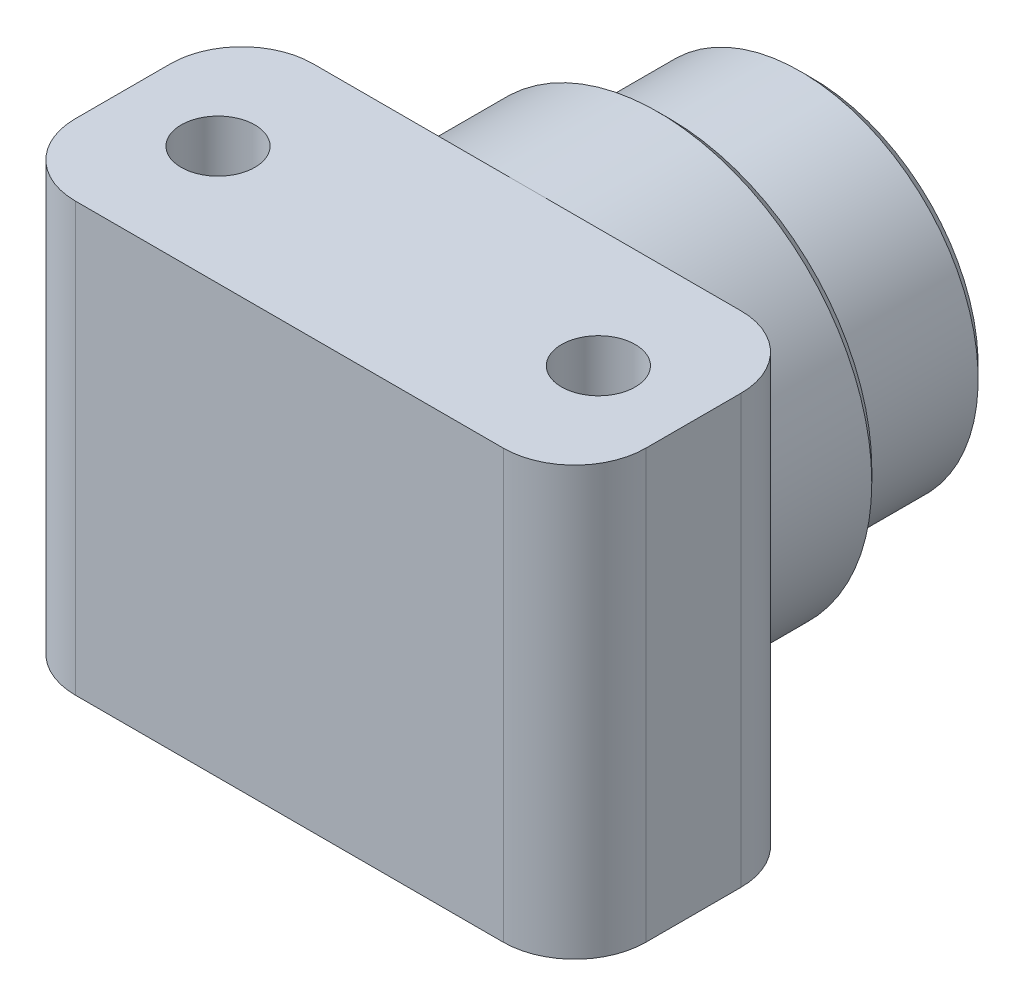
ISO-10303-21;
HEADER;
FILE_DESCRIPTION(('STEP AP214'),'2;1');
FILE_NAME('part.step','',(''),(''),'','','');
FILE_SCHEMA(('AUTOMOTIVE_DESIGN { 1 0 10303 214 1 1 1 1 }'));
ENDSEC;
DATA;
#1=APPLICATION_CONTEXT('core data for automotive mechanical design processes');
#2=APPLICATION_PROTOCOL_DEFINITION('international standard','automotive_design',2000,#1);
#3=PRODUCT_CONTEXT('',#1,'mechanical');
#4=PRODUCT('Part','Part','',(#3));
#5=PRODUCT_RELATED_PRODUCT_CATEGORY('part','',(#4));
#6=PRODUCT_DEFINITION_FORMATION('','',#4);
#7=PRODUCT_DEFINITION_CONTEXT('part definition',#1,'design');
#8=PRODUCT_DEFINITION('design','',#6,#7);
#9=PRODUCT_DEFINITION_SHAPE('','',#8);
#10=(LENGTH_UNIT() NAMED_UNIT(*) SI_UNIT(.MILLI.,.METRE.));
#11=(NAMED_UNIT(*) PLANE_ANGLE_UNIT() SI_UNIT($,.RADIAN.));
#12=(NAMED_UNIT(*) SI_UNIT($,.STERADIAN.) SOLID_ANGLE_UNIT());
#13=UNCERTAINTY_MEASURE_WITH_UNIT(LENGTH_MEASURE(1.E-05),#10,'distance_accuracy_value','');
#14=(GEOMETRIC_REPRESENTATION_CONTEXT(3) GLOBAL_UNCERTAINTY_ASSIGNED_CONTEXT((#13)) GLOBAL_UNIT_ASSIGNED_CONTEXT((#10,
#11,#12)) REPRESENTATION_CONTEXT('',''));
#15=CARTESIAN_POINT('',(0.,0.,0.));
#16=DIRECTION('',(0.,0.,1.));
#17=DIRECTION('',(1.,0.,0.));
#18=AXIS2_PLACEMENT_3D('',#15,#16,#17);
#19=CARTESIAN_POINT('',(0.,0.,0.));
#20=DIRECTION('',(0.,0.,1.));
#21=DIRECTION('',(1.,0.,0.));
#22=AXIS2_PLACEMENT_3D('',#19,#20,#21);
#23=PLANE('',#22);
#24=DIRECTION('',(1.,0.,0.));
#25=VECTOR('',#24,1.);
#26=CARTESIAN_POINT('',(-12.,-9.,0.));
#27=LINE('',#26,#25);
#28=CARTESIAN_POINT('',(-9.,-9.,0.));
#29=VERTEX_POINT('',#28);
#30=CARTESIAN_POINT('',(0.,-9.,0.));
#31=VERTEX_POINT('',#30);
#32=EDGE_CURVE('E110',#29,#31,#27,.T.);
#33=ORIENTED_EDGE('',*,*,#32,.F.);
#34=DIRECTION('',(0.,-1.,0.));
#35=VECTOR('',#34,1.);
#36=CARTESIAN_POINT('',(-9.,0.,0.));
#37=LINE('',#36,#35);
#38=CARTESIAN_POINT('',(-9.,0.,0.));
#39=VERTEX_POINT('',#38);
#40=EDGE_CURVE('E11',#29,#39,#37,.F.);
#41=ORIENTED_EDGE('',*,*,#40,.T.);
#42=CARTESIAN_POINT('',(0.,0.,0.));
#43=DIRECTION('',(0.,0.,1.));
#44=DIRECTION('',(1.,0.,0.));
#45=AXIS2_PLACEMENT_3D('',#42,#43,#44);
#46=CIRCLE('',#45,9.);
#47=EDGE_CURVE('E108',#39,#31,#46,.T.);
#48=ORIENTED_EDGE('',*,*,#47,.T.);
#49=EDGE_LOOP('',(#33,#41,#48));
#50=FACE_BOUND('',#49,.T.);
#51=ADVANCED_FACE('F34',(#50),#23,.F.);
#52=DIRECTION('',(-1.,0.,0.));
#53=VECTOR('',#52,1.);
#54=CARTESIAN_POINT('',(-12.,9.,0.));
#55=LINE('',#54,#53);
#56=CARTESIAN_POINT('',(9.,9.,0.));
#57=VERTEX_POINT('',#56);
#58=CARTESIAN_POINT('',(0.,9.,0.));
#59=VERTEX_POINT('',#58);
#60=EDGE_CURVE('E138',#57,#59,#55,.T.);
#61=ORIENTED_EDGE('',*,*,#60,.F.);
#62=DIRECTION('',(0.,1.,0.));
#63=VECTOR('',#62,1.);
#64=CARTESIAN_POINT('',(9.,0.,0.));
#65=LINE('',#64,#63);
#66=CARTESIAN_POINT('',(9.,0.,0.));
#67=VERTEX_POINT('',#66);
#68=EDGE_CURVE('E55',#57,#67,#65,.F.);
#69=ORIENTED_EDGE('',*,*,#68,.T.);
#70=EDGE_CURVE('E118',#67,#59,#46,.T.);
#71=ORIENTED_EDGE('',*,*,#70,.T.);
#72=EDGE_LOOP('',(#61,#69,#71));
#73=FACE_BOUND('',#72,.T.);
#74=ADVANCED_FACE('F259',(#73),#23,.F.);
#75=EDGE_CURVE('E115',#59,#39,#46,.T.);
#76=ORIENTED_EDGE('',*,*,#75,.T.);
#77=DIRECTION('',(0.,-1.,0.));
#78=VECTOR('',#77,1.);
#79=CARTESIAN_POINT('',(-9.,0.,0.));
#80=LINE('',#79,#78);
#81=CARTESIAN_POINT('',(-9.,9.,0.));
#82=VERTEX_POINT('',#81);
#83=EDGE_CURVE('E42',#39,#82,#80,.F.);
#84=ORIENTED_EDGE('',*,*,#83,.T.);
#85=EDGE_CURVE('E140',#59,#82,#55,.T.);
#86=ORIENTED_EDGE('',*,*,#85,.F.);
#87=EDGE_LOOP('',(#76,#84,#86));
#88=FACE_BOUND('',#87,.T.);
#89=ADVANCED_FACE('F211',(#88),#23,.F.);
#90=CARTESIAN_POINT('',(12.,9.,10.));
#91=DIRECTION('',(-1.,0.,0.));
#92=DIRECTION('',(0.,-1.,0.));
#93=AXIS2_PLACEMENT_3D('',#90,#91,#92);
#94=PLANE('',#93);
#95=DIRECTION('',(0.,0.,-1.));
#96=VECTOR('',#95,1.);
#97=CARTESIAN_POINT('',(12.,9.,10.));
#98=LINE('',#97,#96);
#99=CARTESIAN_POINT('',(12.,9.,7.));
#100=VERTEX_POINT('',#99);
#101=CARTESIAN_POINT('',(12.,9.,3.));
#102=VERTEX_POINT('',#101);
#103=EDGE_CURVE('E153',#100,#102,#98,.T.);
#104=ORIENTED_EDGE('',*,*,#103,.F.);
#105=DIRECTION('',(0.,1.,0.));
#106=VECTOR('',#105,1.);
#107=CARTESIAN_POINT('',(12.,-9.,7.));
#108=LINE('',#107,#106);
#109=CARTESIAN_POINT('',(12.,-9.,7.));
#110=VERTEX_POINT('',#109);
#111=EDGE_CURVE('E192',#100,#110,#108,.F.);
#112=ORIENTED_EDGE('',*,*,#111,.T.);
#113=DIRECTION('',(0.,0.,-1.));
#114=VECTOR('',#113,1.);
#115=CARTESIAN_POINT('',(12.,-9.,10.));
#116=LINE('',#115,#114);
#117=CARTESIAN_POINT('',(12.,-9.,3.));
#118=VERTEX_POINT('',#117);
#119=EDGE_CURVE('E144',#110,#118,#116,.T.);
#120=ORIENTED_EDGE('',*,*,#119,.T.);
#121=DIRECTION('',(0.,1.,0.));
#122=VECTOR('',#121,1.);
#123=CARTESIAN_POINT('',(12.,9.,3.));
#124=LINE('',#123,#122);
#125=EDGE_CURVE('E189',#118,#102,#124,.T.);
#126=ORIENTED_EDGE('',*,*,#125,.T.);
#127=EDGE_LOOP('',(#104,#112,#120,#126));
#128=FACE_BOUND('',#127,.T.);
#129=ADVANCED_FACE('F271',(#128),#94,.F.);
#130=CARTESIAN_POINT('',(-12.,9.,10.));
#131=DIRECTION('',(0.,-1.,0.));
#132=DIRECTION('',(0.,0.,-1.));
#133=AXIS2_PLACEMENT_3D('',#130,#131,#132);
#134=PLANE('',#133);
#135=CARTESIAN_POINT('',(8.,9.,5.));
#136=DIRECTION('',(0.,1.,0.));
#137=DIRECTION('',(0.,0.,1.));
#138=AXIS2_PLACEMENT_3D('',#135,#136,#137);
#139=CIRCLE('',#138,1.55);
#140=CARTESIAN_POINT('',(8.,9.,6.55));
#141=VERTEX_POINT('',#140);
#142=EDGE_CURVE('E162',#141,#141,#139,.T.);
#143=ORIENTED_EDGE('',*,*,#142,.F.);
#144=EDGE_LOOP('',(#143));
#145=FACE_BOUND('',#144,.T.);
#146=CARTESIAN_POINT('',(-8.,9.,5.));
#147=DIRECTION('',(0.,1.,0.));
#148=DIRECTION('',(0.,0.,1.));
#149=AXIS2_PLACEMENT_3D('',#146,#147,#148);
#150=CIRCLE('',#149,1.55);
#151=CARTESIAN_POINT('',(-8.,9.,6.55));
#152=VERTEX_POINT('',#151);
#153=EDGE_CURVE('E158',#152,#152,#150,.T.);
#154=ORIENTED_EDGE('',*,*,#153,.F.);
#155=EDGE_LOOP('',(#154));
#156=FACE_BOUND('',#155,.T.);
#157=DIRECTION('',(-1.,0.,0.));
#158=VECTOR('',#157,1.);
#159=CARTESIAN_POINT('',(-12.,9.,10.));
#160=LINE('',#159,#158);
#161=CARTESIAN_POINT('',(9.,9.,10.));
#162=VERTEX_POINT('',#161);
#163=CARTESIAN_POINT('',(-9.,9.,10.));
#164=VERTEX_POINT('',#163);
#165=EDGE_CURVE('E128',#162,#164,#160,.T.);
#166=ORIENTED_EDGE('',*,*,#165,.F.);
#167=CARTESIAN_POINT('',(9.,9.,7.));
#168=DIRECTION('',(0.,-1.,0.));
#169=DIRECTION('',(0.,0.,-1.));
#170=AXIS2_PLACEMENT_3D('',#167,#168,#169);
#171=CIRCLE('',#170,3.);
#172=EDGE_CURVE('E187',#162,#100,#171,.F.);
#173=ORIENTED_EDGE('',*,*,#172,.T.);
#174=ORIENTED_EDGE('',*,*,#103,.T.);
#175=CARTESIAN_POINT('',(9.,9.,3.));
#176=DIRECTION('',(0.,-1.,0.));
#177=DIRECTION('',(0.,0.,-1.));
#178=AXIS2_PLACEMENT_3D('',#175,#176,#177);
#179=CIRCLE('',#178,3.);
#180=EDGE_CURVE('E185',#102,#57,#179,.F.);
#181=ORIENTED_EDGE('',*,*,#180,.T.);
#182=ORIENTED_EDGE('',*,*,#60,.T.);
#183=ORIENTED_EDGE('',*,*,#85,.T.);
#184=CARTESIAN_POINT('',(-9.,9.,3.));
#185=DIRECTION('',(0.,-1.,0.));
#186=DIRECTION('',(0.,0.,-1.));
#187=AXIS2_PLACEMENT_3D('',#184,#185,#186);
#188=CIRCLE('',#187,3.);
#189=CARTESIAN_POINT('',(-12.,9.,3.));
#190=VERTEX_POINT('',#189);
#191=EDGE_CURVE('E181',#82,#190,#188,.F.);
#192=ORIENTED_EDGE('',*,*,#191,.T.);
#193=DIRECTION('',(0.,0.,-1.));
#194=VECTOR('',#193,1.);
#195=CARTESIAN_POINT('',(-12.,9.,10.));
#196=LINE('',#195,#194);
#197=CARTESIAN_POINT('',(-12.,9.,7.));
#198=VERTEX_POINT('',#197);
#199=EDGE_CURVE('E150',#198,#190,#196,.T.);
#200=ORIENTED_EDGE('',*,*,#199,.F.);
#201=CARTESIAN_POINT('',(-9.,9.,7.));
#202=DIRECTION('',(0.,-1.,0.));
#203=DIRECTION('',(0.,0.,-1.));
#204=AXIS2_PLACEMENT_3D('',#201,#202,#203);
#205=CIRCLE('',#204,3.);
#206=EDGE_CURVE('E183',#198,#164,#205,.F.);
#207=ORIENTED_EDGE('',*,*,#206,.T.);
#208=EDGE_LOOP('',(#166,#173,#174,#181,#182,#183,#192,#200,#207));
#209=FACE_BOUND('',#208,.T.);
#210=ADVANCED_FACE('F216',(#145,#156,#209),#134,.F.);
#211=CARTESIAN_POINT('',(-12.,9.,10.));
#212=DIRECTION('',(1.,0.,0.));
#213=DIRECTION('',(0.,1.,0.));
#214=AXIS2_PLACEMENT_3D('',#211,#212,#213);
#215=PLANE('',#214);
#216=DIRECTION('',(0.,0.,-1.));
#217=VECTOR('',#216,1.);
#218=CARTESIAN_POINT('',(-12.,-9.,10.));
#219=LINE('',#218,#217);
#220=CARTESIAN_POINT('',(-12.,-9.,7.));
#221=VERTEX_POINT('',#220);
#222=CARTESIAN_POINT('',(-12.,-9.,3.));
#223=VERTEX_POINT('',#222);
#224=EDGE_CURVE('E147',#221,#223,#219,.T.);
#225=ORIENTED_EDGE('',*,*,#224,.F.);
#226=DIRECTION('',(0.,-1.,0.));
#227=VECTOR('',#226,1.);
#228=CARTESIAN_POINT('',(-12.,9.,7.));
#229=LINE('',#228,#227);
#230=EDGE_CURVE('E206',#221,#198,#229,.F.);
#231=ORIENTED_EDGE('',*,*,#230,.T.);
#232=ORIENTED_EDGE('',*,*,#199,.T.);
#233=DIRECTION('',(0.,-1.,0.));
#234=VECTOR('',#233,1.);
#235=CARTESIAN_POINT('',(-12.,9.,3.));
#236=LINE('',#235,#234);
#237=EDGE_CURVE('E203',#190,#223,#236,.T.);
#238=ORIENTED_EDGE('',*,*,#237,.T.);
#239=EDGE_LOOP('',(#225,#231,#232,#238));
#240=FACE_BOUND('',#239,.T.);
#241=ADVANCED_FACE('F221',(#240),#215,.F.);
#242=CARTESIAN_POINT('',(-12.,-9.,10.));
#243=DIRECTION('',(0.,1.,0.));
#244=DIRECTION('',(0.,0.,1.));
#245=AXIS2_PLACEMENT_3D('',#242,#243,#244);
#246=PLANE('',#245);
#247=CARTESIAN_POINT('',(8.,-9.,5.));
#248=DIRECTION('',(0.,1.,0.));
#249=DIRECTION('',(0.,0.,1.));
#250=AXIS2_PLACEMENT_3D('',#247,#248,#249);
#251=CIRCLE('',#250,1.55);
#252=CARTESIAN_POINT('',(8.,-9.,6.55));
#253=VERTEX_POINT('',#252);
#254=EDGE_CURVE('E159',#253,#253,#251,.T.);
#255=ORIENTED_EDGE('',*,*,#254,.T.);
#256=EDGE_LOOP('',(#255));
#257=FACE_BOUND('',#256,.T.);
#258=CARTESIAN_POINT('',(-8.,-9.,5.));
#259=DIRECTION('',(0.,1.,0.));
#260=DIRECTION('',(0.,0.,1.));
#261=AXIS2_PLACEMENT_3D('',#258,#259,#260);
#262=CIRCLE('',#261,1.55);
#263=CARTESIAN_POINT('',(-8.,-9.,6.55));
#264=VERTEX_POINT('',#263);
#265=EDGE_CURVE('E116',#264,#264,#262,.T.);
#266=ORIENTED_EDGE('',*,*,#265,.T.);
#267=EDGE_LOOP('',(#266));
#268=FACE_BOUND('',#267,.T.);
#269=ORIENTED_EDGE('',*,*,#119,.F.);
#270=CARTESIAN_POINT('',(9.,-9.,7.));
#271=DIRECTION('',(0.,1.,0.));
#272=DIRECTION('',(0.,0.,1.));
#273=AXIS2_PLACEMENT_3D('',#270,#271,#272);
#274=CIRCLE('',#273,3.);
#275=CARTESIAN_POINT('',(9.,-9.,10.));
#276=VERTEX_POINT('',#275);
#277=EDGE_CURVE('E199',#110,#276,#274,.F.);
#278=ORIENTED_EDGE('',*,*,#277,.T.);
#279=DIRECTION('',(1.,0.,0.));
#280=VECTOR('',#279,1.);
#281=CARTESIAN_POINT('',(-12.,-9.,10.));
#282=LINE('',#281,#280);
#283=CARTESIAN_POINT('',(-9.,-9.,10.));
#284=VERTEX_POINT('',#283);
#285=EDGE_CURVE('E148',#284,#276,#282,.T.);
#286=ORIENTED_EDGE('',*,*,#285,.F.);
#287=CARTESIAN_POINT('',(-9.,-9.,7.));
#288=DIRECTION('',(0.,1.,0.));
#289=DIRECTION('',(0.,0.,1.));
#290=AXIS2_PLACEMENT_3D('',#287,#288,#289);
#291=CIRCLE('',#290,3.);
#292=EDGE_CURVE('E195',#284,#221,#291,.F.);
#293=ORIENTED_EDGE('',*,*,#292,.T.);
#294=ORIENTED_EDGE('',*,*,#224,.T.);
#295=CARTESIAN_POINT('',(-9.,-9.,3.));
#296=DIRECTION('',(0.,1.,0.));
#297=DIRECTION('',(0.,0.,1.));
#298=AXIS2_PLACEMENT_3D('',#295,#296,#297);
#299=CIRCLE('',#298,3.);
#300=EDGE_CURVE('E127',#223,#29,#299,.F.);
#301=ORIENTED_EDGE('',*,*,#300,.T.);
#302=ORIENTED_EDGE('',*,*,#32,.T.);
#303=CARTESIAN_POINT('',(9.,-9.,0.));
#304=VERTEX_POINT('',#303);
#305=EDGE_CURVE('E124',#31,#304,#27,.T.);
#306=ORIENTED_EDGE('',*,*,#305,.T.);
#307=CARTESIAN_POINT('',(9.,-9.,3.));
#308=DIRECTION('',(0.,1.,0.));
#309=DIRECTION('',(0.,0.,1.));
#310=AXIS2_PLACEMENT_3D('',#307,#308,#309);
#311=CIRCLE('',#310,3.);
#312=EDGE_CURVE('E197',#304,#118,#311,.F.);
#313=ORIENTED_EDGE('',*,*,#312,.T.);
#314=EDGE_LOOP('',(#269,#278,#286,#293,#294,#301,#302,#306,#313));
#315=FACE_BOUND('',#314,.T.);
#316=ADVANCED_FACE('F122',(#257,#268,#315),#246,.F.);
#317=CARTESIAN_POINT('',(0.,0.,10.));
#318=DIRECTION('',(0.,0.,1.));
#319=DIRECTION('',(1.,0.,0.));
#320=AXIS2_PLACEMENT_3D('',#317,#318,#319);
#321=PLANE('',#320);
#322=ORIENTED_EDGE('',*,*,#285,.T.);
#323=DIRECTION('',(0.,1.,0.));
#324=VECTOR('',#323,1.);
#325=CARTESIAN_POINT('',(9.,9.,10.));
#326=LINE('',#325,#324);
#327=EDGE_CURVE('E178',#276,#162,#326,.T.);
#328=ORIENTED_EDGE('',*,*,#327,.T.);
#329=ORIENTED_EDGE('',*,*,#165,.T.);
#330=DIRECTION('',(0.,-1.,0.));
#331=VECTOR('',#330,1.);
#332=CARTESIAN_POINT('',(-9.,-9.,10.));
#333=LINE('',#332,#331);
#334=EDGE_CURVE('E175',#164,#284,#333,.T.);
#335=ORIENTED_EDGE('',*,*,#334,.T.);
#336=EDGE_LOOP('',(#322,#328,#329,#335));
#337=FACE_BOUND('',#336,.T.);
#338=ADVANCED_FACE('F231',(#337),#321,.T.);
#339=EDGE_CURVE('E131',#31,#67,#46,.T.);
#340=ORIENTED_EDGE('',*,*,#339,.T.);
#341=DIRECTION('',(0.,1.,0.));
#342=VECTOR('',#341,1.);
#343=CARTESIAN_POINT('',(9.,0.,0.));
#344=LINE('',#343,#342);
#345=EDGE_CURVE('E137',#67,#304,#344,.F.);
#346=ORIENTED_EDGE('',*,*,#345,.T.);
#347=ORIENTED_EDGE('',*,*,#305,.F.);
#348=EDGE_LOOP('',(#340,#346,#347));
#349=FACE_BOUND('',#348,.T.);
#350=ADVANCED_FACE('F136',(#349),#23,.F.);
#351=CARTESIAN_POINT('',(0.,0.,-6.));
#352=DIRECTION('',(0.,0.,1.));
#353=DIRECTION('',(1.,0.,0.));
#354=AXIS2_PLACEMENT_3D('',#351,#352,#353);
#355=CYLINDRICAL_SURFACE('',#354,9.);
#356=CARTESIAN_POINT('',(0.,0.,-5.5));
#357=DIRECTION('',(0.,0.,1.));
#358=DIRECTION('',(1.,0.,0.));
#359=AXIS2_PLACEMENT_3D('',#356,#357,#358);
#360=CIRCLE('',#359,9.);
#361=CARTESIAN_POINT('',(9.,0.,-5.5));
#362=VERTEX_POINT('',#361);
#363=EDGE_CURVE('E163',#362,#362,#360,.T.);
#364=ORIENTED_EDGE('',*,*,#363,.T.);
#365=EDGE_LOOP('',(#364));
#366=FACE_BOUND('',#365,.T.);
#367=ORIENTED_EDGE('',*,*,#75,.F.);
#368=ORIENTED_EDGE('',*,*,#70,.F.);
#369=ORIENTED_EDGE('',*,*,#339,.F.);
#370=ORIENTED_EDGE('',*,*,#47,.F.);
#371=EDGE_LOOP('',(#367,#368,#369,#370));
#372=FACE_BOUND('',#371,.T.);
#373=ADVANCED_FACE('F132',(#366,#372),#355,.T.);
#374=CARTESIAN_POINT('',(0.,0.,-6.));
#375=DIRECTION('',(0.,0.,1.));
#376=DIRECTION('',(1.,0.,0.));
#377=AXIS2_PLACEMENT_3D('',#374,#375,#376);
#378=PLANE('',#377);
#379=CARTESIAN_POINT('',(0.,0.,-6.));
#380=DIRECTION('',(0.,0.,1.));
#381=DIRECTION('',(1.,0.,0.));
#382=AXIS2_PLACEMENT_3D('',#379,#380,#381);
#383=CIRCLE('',#382,8.5);
#384=CARTESIAN_POINT('',(8.5,0.,-6.));
#385=VERTEX_POINT('',#384);
#386=EDGE_CURVE('E166',#385,#385,#383,.F.);
#387=ORIENTED_EDGE('',*,*,#386,.T.);
#388=EDGE_LOOP('',(#387));
#389=FACE_BOUND('',#388,.T.);
#390=CARTESIAN_POINT('',(0.,0.,-6.));
#391=DIRECTION('',(0.,0.,-1.));
#392=DIRECTION('',(-1.,0.,0.));
#393=AXIS2_PLACEMENT_3D('',#390,#391,#392);
#394=CIRCLE('',#393,7.475);
#395=CARTESIAN_POINT('',(-7.475,0.,-6.));
#396=VERTEX_POINT('',#395);
#397=EDGE_CURVE('E135',#396,#396,#394,.T.);
#398=ORIENTED_EDGE('',*,*,#397,.F.);
#399=EDGE_LOOP('',(#398));
#400=FACE_BOUND('',#399,.T.);
#401=ADVANCED_FACE('F244',(#389,#400),#378,.F.);
#402=CARTESIAN_POINT('',(-8.,-28.013519789092,5.));
#403=DIRECTION('',(0.,1.,0.));
#404=DIRECTION('',(0.,0.,1.));
#405=AXIS2_PLACEMENT_3D('',#402,#403,#404);
#406=CYLINDRICAL_SURFACE('',#405,1.55);
#407=ORIENTED_EDGE('',*,*,#153,.T.);
#408=EDGE_LOOP('',(#407));
#409=FACE_BOUND('',#408,.T.);
#410=ORIENTED_EDGE('',*,*,#265,.F.);
#411=EDGE_LOOP('',(#410));
#412=FACE_BOUND('',#411,.T.);
#413=ADVANCED_FACE('F246',(#409,#412),#406,.F.);
#414=CARTESIAN_POINT('',(8.,-28.013519789092,5.));
#415=DIRECTION('',(0.,1.,0.));
#416=DIRECTION('',(0.,0.,1.));
#417=AXIS2_PLACEMENT_3D('',#414,#415,#416);
#418=CYLINDRICAL_SURFACE('',#417,1.55);
#419=ORIENTED_EDGE('',*,*,#142,.T.);
#420=EDGE_LOOP('',(#419));
#421=FACE_BOUND('',#420,.T.);
#422=ORIENTED_EDGE('',*,*,#254,.F.);
#423=EDGE_LOOP('',(#422));
#424=FACE_BOUND('',#423,.T.);
#425=ADVANCED_FACE('F253',(#421,#424),#418,.F.);
#426=CARTESIAN_POINT('',(0.,0.,-12.));
#427=DIRECTION('',(0.,0.,1.));
#428=DIRECTION('',(1.,0.,0.));
#429=AXIS2_PLACEMENT_3D('',#426,#427,#428);
#430=CYLINDRICAL_SURFACE('',#429,7.475);
#431=CARTESIAN_POINT('',(0.,0.,-11.5));
#432=DIRECTION('',(0.,0.,-1.));
#433=DIRECTION('',(-1.,0.,0.));
#434=AXIS2_PLACEMENT_3D('',#431,#432,#433);
#435=CIRCLE('',#434,7.475);
#436=CARTESIAN_POINT('',(-7.475,0.,-11.5));
#437=VERTEX_POINT('',#436);
#438=EDGE_CURVE('E172',#437,#437,#435,.F.);
#439=ORIENTED_EDGE('',*,*,#438,.T.);
#440=EDGE_LOOP('',(#439));
#441=FACE_BOUND('',#440,.T.);
#442=ORIENTED_EDGE('',*,*,#397,.T.);
#443=EDGE_LOOP('',(#442));
#444=FACE_BOUND('',#443,.T.);
#445=ADVANCED_FACE('F242',(#441,#444),#430,.T.);
#446=CARTESIAN_POINT('',(0.,0.,-12.));
#447=DIRECTION('',(0.,0.,-1.));
#448=DIRECTION('',(-1.,0.,0.));
#449=AXIS2_PLACEMENT_3D('',#446,#447,#448);
#450=PLANE('',#449);
#451=CARTESIAN_POINT('',(0.,0.,-12.));
#452=DIRECTION('',(0.,0.,-1.));
#453=DIRECTION('',(-1.,0.,0.));
#454=AXIS2_PLACEMENT_3D('',#451,#452,#453);
#455=CIRCLE('',#454,6.975);
#456=CARTESIAN_POINT('',(-6.975,0.,-12.));
#457=VERTEX_POINT('',#456);
#458=EDGE_CURVE('E169',#457,#457,#455,.T.);
#459=ORIENTED_EDGE('',*,*,#458,.T.);
#460=EDGE_LOOP('',(#459));
#461=FACE_BOUND('',#460,.T.);
#462=ADVANCED_FACE('F289',(#461),#450,.T.);
#463=CARTESIAN_POINT('',(0.,0.,-5.5));
#464=DIRECTION('',(0.,0.,1.));
#465=DIRECTION('',(1.,0.,0.));
#466=AXIS2_PLACEMENT_3D('',#463,#464,#465);
#467=CONICAL_SURFACE('',#466,9.,0.785398163397448);
#468=ORIENTED_EDGE('',*,*,#386,.F.);
#469=EDGE_LOOP('',(#468));
#470=FACE_BOUND('',#469,.T.);
#471=ORIENTED_EDGE('',*,*,#363,.F.);
#472=EDGE_LOOP('',(#471));
#473=FACE_BOUND('',#472,.T.);
#474=ADVANCED_FACE('F285',(#470,#473),#467,.T.);
#475=CARTESIAN_POINT('',(0.,0.,-12.));
#476=DIRECTION('',(0.,0.,1.));
#477=DIRECTION('',(1.,0.,0.));
#478=AXIS2_PLACEMENT_3D('',#475,#476,#477);
#479=CONICAL_SURFACE('',#478,6.975,0.785398163397447);
#480=ORIENTED_EDGE('',*,*,#438,.F.);
#481=EDGE_LOOP('',(#480));
#482=FACE_BOUND('',#481,.T.);
#483=ORIENTED_EDGE('',*,*,#458,.F.);
#484=EDGE_LOOP('',(#483));
#485=FACE_BOUND('',#484,.T.);
#486=ADVANCED_FACE('F288',(#482,#485),#479,.T.);
#487=CARTESIAN_POINT('',(9.,0.,7.));
#488=DIRECTION('',(0.,-1.,0.));
#489=DIRECTION('',(1.,0.,0.));
#490=AXIS2_PLACEMENT_3D('',#487,#488,#489);
#491=CYLINDRICAL_SURFACE('',#490,3.);
#492=ORIENTED_EDGE('',*,*,#277,.F.);
#493=ORIENTED_EDGE('',*,*,#111,.F.);
#494=ORIENTED_EDGE('',*,*,#172,.F.);
#495=ORIENTED_EDGE('',*,*,#327,.F.);
#496=EDGE_LOOP('',(#492,#493,#494,#495));
#497=FACE_BOUND('',#496,.T.);
#498=ADVANCED_FACE('F293',(#497),#491,.T.);
#499=CARTESIAN_POINT('',(9.,9.,3.));
#500=DIRECTION('',(0.,1.,0.));
#501=DIRECTION('',(-1.,0.,0.));
#502=AXIS2_PLACEMENT_3D('',#499,#500,#501);
#503=CYLINDRICAL_SURFACE('',#502,3.);
#504=ORIENTED_EDGE('',*,*,#345,.F.);
#505=ORIENTED_EDGE('',*,*,#68,.F.);
#506=ORIENTED_EDGE('',*,*,#180,.F.);
#507=ORIENTED_EDGE('',*,*,#125,.F.);
#508=ORIENTED_EDGE('',*,*,#312,.F.);
#509=EDGE_LOOP('',(#504,#505,#506,#507,#508));
#510=FACE_BOUND('',#509,.T.);
#511=ADVANCED_FACE('F297',(#510),#503,.T.);
#512=CARTESIAN_POINT('',(-9.,0.,7.));
#513=DIRECTION('',(0.,1.,0.));
#514=DIRECTION('',(-1.,0.,0.));
#515=AXIS2_PLACEMENT_3D('',#512,#513,#514);
#516=CYLINDRICAL_SURFACE('',#515,3.);
#517=ORIENTED_EDGE('',*,*,#206,.F.);
#518=ORIENTED_EDGE('',*,*,#230,.F.);
#519=ORIENTED_EDGE('',*,*,#292,.F.);
#520=ORIENTED_EDGE('',*,*,#334,.F.);
#521=EDGE_LOOP('',(#517,#518,#519,#520));
#522=FACE_BOUND('',#521,.T.);
#523=ADVANCED_FACE('F228',(#522),#516,.T.);
#524=CARTESIAN_POINT('',(-9.,9.,3.));
#525=DIRECTION('',(0.,-1.,0.));
#526=DIRECTION('',(1.,0.,0.));
#527=AXIS2_PLACEMENT_3D('',#524,#525,#526);
#528=CYLINDRICAL_SURFACE('',#527,3.);
#529=ORIENTED_EDGE('',*,*,#83,.F.);
#530=ORIENTED_EDGE('',*,*,#40,.F.);
#531=ORIENTED_EDGE('',*,*,#300,.F.);
#532=ORIENTED_EDGE('',*,*,#237,.F.);
#533=ORIENTED_EDGE('',*,*,#191,.F.);
#534=EDGE_LOOP('',(#529,#530,#531,#532,#533));
#535=FACE_BOUND('',#534,.T.);
#536=ADVANCED_FACE('F36',(#535),#528,.T.);
#537=CLOSED_SHELL('',(#51,#74,#89,#129,#210,#241,#316,#338,#350,#373,#401,#413,#425,#445,#462,
#474,#486,#498,#511,#523,#536));
#538=MANIFOLD_SOLID_BREP('B2',#537);
#539=ADVANCED_BREP_SHAPE_REPRESENTATION('',(#18,#538),#14);
#540=SHAPE_DEFINITION_REPRESENTATION(#9,#539);
ENDSEC;
END-ISO-10303-21;
